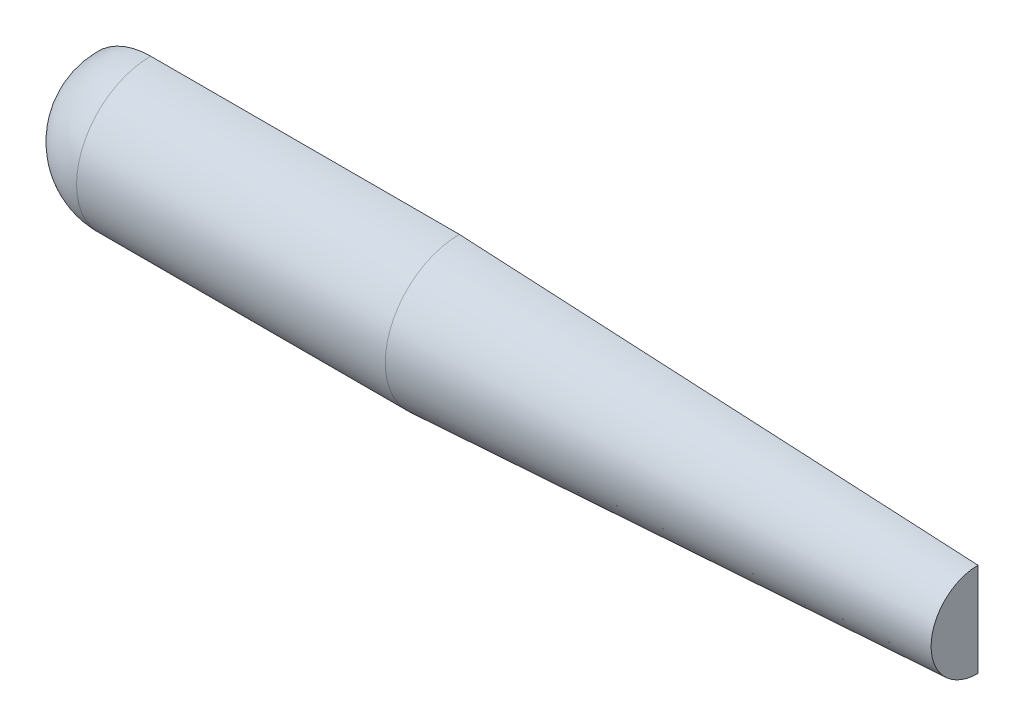
ISO-10303-21;
HEADER;
FILE_DESCRIPTION(('STEP AP214'),'2;1');
FILE_NAME('part.step','',(''),(''),'','','');
FILE_SCHEMA(('AUTOMOTIVE_DESIGN { 1 0 10303 214 1 1 1 1 }'));
ENDSEC;
DATA;
#1=APPLICATION_CONTEXT('core data for automotive mechanical design processes');
#2=APPLICATION_PROTOCOL_DEFINITION('international standard','automotive_design',2000,#1);
#3=PRODUCT_CONTEXT('',#1,'mechanical');
#4=PRODUCT('Part','Part','',(#3));
#5=PRODUCT_RELATED_PRODUCT_CATEGORY('part','',(#4));
#6=PRODUCT_DEFINITION_FORMATION('','',#4);
#7=PRODUCT_DEFINITION_CONTEXT('part definition',#1,'design');
#8=PRODUCT_DEFINITION('design','',#6,#7);
#9=PRODUCT_DEFINITION_SHAPE('','',#8);
#10=(LENGTH_UNIT() NAMED_UNIT(*) SI_UNIT(.MILLI.,.METRE.));
#11=(NAMED_UNIT(*) PLANE_ANGLE_UNIT() SI_UNIT($,.RADIAN.));
#12=(NAMED_UNIT(*) SI_UNIT($,.STERADIAN.) SOLID_ANGLE_UNIT());
#13=UNCERTAINTY_MEASURE_WITH_UNIT(LENGTH_MEASURE(1.E-05),#10,'distance_accuracy_value','');
#14=(GEOMETRIC_REPRESENTATION_CONTEXT(3) GLOBAL_UNCERTAINTY_ASSIGNED_CONTEXT((#13)) GLOBAL_UNIT_ASSIGNED_CONTEXT((#10,
#11,#12)) REPRESENTATION_CONTEXT('',''));
#15=CARTESIAN_POINT('',(0.,0.,0.));
#16=DIRECTION('',(0.,0.,1.));
#17=DIRECTION('',(1.,0.,0.));
#18=AXIS2_PLACEMENT_3D('',#15,#16,#17);
#19=CARTESIAN_POINT('',(317.330606416407,34.1776677362758,0.));
#20=DIRECTION('',(0.,0.,-1.));
#21=DIRECTION('',(-1.,0.,0.));
#22=AXIS2_PLACEMENT_3D('',#19,#20,#21);
#23=PLANE('',#22);
#24=DIRECTION('',(1.,0.,0.));
#25=VECTOR('',#24,1.);
#26=CARTESIAN_POINT('',(-63.5,-8.89,0.));
#27=LINE('',#26,#25);
#28=CARTESIAN_POINT('',(-63.5,-8.89,0.));
#29=VERTEX_POINT('',#28);
#30=CARTESIAN_POINT('',(0.,-8.88999999999999,0.));
#31=VERTEX_POINT('',#30);
#32=EDGE_CURVE('E73',#29,#31,#27,.T.);
#33=ORIENTED_EDGE('',*,*,#32,.F.);
#34=CARTESIAN_POINT('',(-63.5,6.35,0.));
#35=DIRECTION('',(0.,0.,-1.));
#36=DIRECTION('',(-1.,0.,0.));
#37=AXIS2_PLACEMENT_3D('',#34,#35,#36);
#38=CIRCLE('',#37,15.24);
#39=CARTESIAN_POINT('',(-63.5,21.59,0.));
#40=VERTEX_POINT('',#39);
#41=EDGE_CURVE('E51',#29,#40,#38,.T.);
#42=ORIENTED_EDGE('',*,*,#41,.T.);
#43=DIRECTION('',(1.,0.,0.));
#44=VECTOR('',#43,1.);
#45=CARTESIAN_POINT('',(-63.5,21.59,0.));
#46=LINE('',#45,#44);
#47=CARTESIAN_POINT('',(0.,21.59,0.));
#48=VERTEX_POINT('',#47);
#49=EDGE_CURVE('E78',#48,#40,#46,.F.);
#50=ORIENTED_EDGE('',*,*,#49,.F.);
#51=DIRECTION('',(0.998629534754574,-0.0523359562429439,0.));
#52=VECTOR('',#51,1.);
#53=CARTESIAN_POINT('',(290.796523120977,6.35,0.));
#54=LINE('',#53,#52);
#55=CARTESIAN_POINT('',(106.68,15.9991381060851,0.));
#56=VERTEX_POINT('',#55);
#57=EDGE_CURVE('E46',#48,#56,#54,.T.);
#58=ORIENTED_EDGE('',*,*,#57,.T.);
#59=DIRECTION('',(0.,1.,0.));
#60=VECTOR('',#59,1.);
#61=CARTESIAN_POINT('',(106.68,6.35,0.));
#62=LINE('',#61,#60);
#63=CARTESIAN_POINT('',(106.68,-3.29913810608515,0.));
#64=VERTEX_POINT('',#63);
#65=EDGE_CURVE('E11',#64,#56,#62,.T.);
#66=ORIENTED_EDGE('',*,*,#65,.F.);
#67=DIRECTION('',(-0.998629534754574,-0.0523359562429439,0.));
#68=VECTOR('',#67,1.);
#69=CARTESIAN_POINT('',(290.796523120977,6.35,0.));
#70=LINE('',#69,#68);
#71=EDGE_CURVE('E62',#64,#31,#70,.T.);
#72=ORIENTED_EDGE('',*,*,#71,.T.);
#73=EDGE_LOOP('',(#33,#42,#50,#58,#66,#72));
#74=FACE_BOUND('',#73,.T.);
#75=ADVANCED_FACE('F31',(#74),#23,.T.);
#76=CARTESIAN_POINT('',(-63.5,6.35,0.));
#77=DIRECTION('',(1.,0.,0.));
#78=DIRECTION('',(0.,0.,-1.));
#79=AXIS2_PLACEMENT_3D('',#76,#77,#78);
#80=CYLINDRICAL_SURFACE('',#79,15.24);
#81=CARTESIAN_POINT('',(0.,6.35,0.));
#82=DIRECTION('',(1.,0.,0.));
#83=DIRECTION('',(0.,0.,-1.));
#84=AXIS2_PLACEMENT_3D('',#81,#82,#83);
#85=CIRCLE('',#84,15.24);
#86=EDGE_CURVE('E72',#48,#31,#85,.T.);
#87=ORIENTED_EDGE('',*,*,#86,.F.);
#88=ORIENTED_EDGE('',*,*,#49,.T.);
#89=CARTESIAN_POINT('',(-63.5,6.35,0.));
#90=DIRECTION('',(1.,0.,0.));
#91=DIRECTION('',(0.,0.,-1.));
#92=AXIS2_PLACEMENT_3D('',#89,#90,#91);
#93=CIRCLE('',#92,15.24);
#94=EDGE_CURVE('E39',#40,#29,#93,.T.);
#95=ORIENTED_EDGE('',*,*,#94,.T.);
#96=ORIENTED_EDGE('',*,*,#32,.T.);
#97=EDGE_LOOP('',(#87,#88,#95,#96));
#98=FACE_BOUND('',#97,.T.);
#99=ADVANCED_FACE('F84',(#98),#80,.T.);
#100=CARTESIAN_POINT('',(-63.5,6.35,0.));
#101=DIRECTION('',(0.,0.,1.));
#102=DIRECTION('',(1.,0.,0.));
#103=AXIS2_PLACEMENT_3D('',#100,#101,#102);
#104=SPHERICAL_SURFACE('',#103,15.24);
#105=ORIENTED_EDGE('',*,*,#41,.F.);
#106=ORIENTED_EDGE('',*,*,#94,.F.);
#107=EDGE_LOOP('',(#105,#106));
#108=FACE_BOUND('',#107,.T.);
#109=ADVANCED_FACE('F33',(#108),#104,.T.);
#110=CARTESIAN_POINT('',(0.,6.35,0.));
#111=DIRECTION('',(-1.,0.,0.));
#112=DIRECTION('',(0.,0.,-1.));
#113=AXIS2_PLACEMENT_3D('',#110,#111,#112);
#114=CONICAL_SURFACE('',#113,15.24,0.05235987755983);
#115=ORIENTED_EDGE('',*,*,#71,.F.);
#116=CARTESIAN_POINT('',(106.68,6.35,0.));
#117=DIRECTION('',(1.,0.,0.));
#118=DIRECTION('',(0.,0.,-1.));
#119=AXIS2_PLACEMENT_3D('',#116,#117,#118);
#120=CIRCLE('',#119,9.64913810608515);
#121=EDGE_CURVE('E70',#56,#64,#120,.T.);
#122=ORIENTED_EDGE('',*,*,#121,.F.);
#123=ORIENTED_EDGE('',*,*,#57,.F.);
#124=ORIENTED_EDGE('',*,*,#86,.T.);
#125=EDGE_LOOP('',(#115,#122,#123,#124));
#126=FACE_BOUND('',#125,.T.);
#127=ADVANCED_FACE('F69',(#126),#114,.T.);
#128=CARTESIAN_POINT('',(106.68,6.35,0.));
#129=DIRECTION('',(1.,0.,0.));
#130=DIRECTION('',(0.,0.,-1.));
#131=AXIS2_PLACEMENT_3D('',#128,#129,#130);
#132=PLANE('',#131);
#133=ORIENTED_EDGE('',*,*,#121,.T.);
#134=ORIENTED_EDGE('',*,*,#65,.T.);
#135=EDGE_LOOP('',(#133,#134));
#136=FACE_BOUND('',#135,.T.);
#137=ADVANCED_FACE('F75',(#136),#132,.T.);
#138=CLOSED_SHELL('',(#75,#99,#109,#127,#137));
#139=MANIFOLD_SOLID_BREP('B2',#138);
#140=ADVANCED_BREP_SHAPE_REPRESENTATION('',(#18,#139),#14);
#141=SHAPE_DEFINITION_REPRESENTATION(#9,#140);
ENDSEC;
END-ISO-10303-21;
